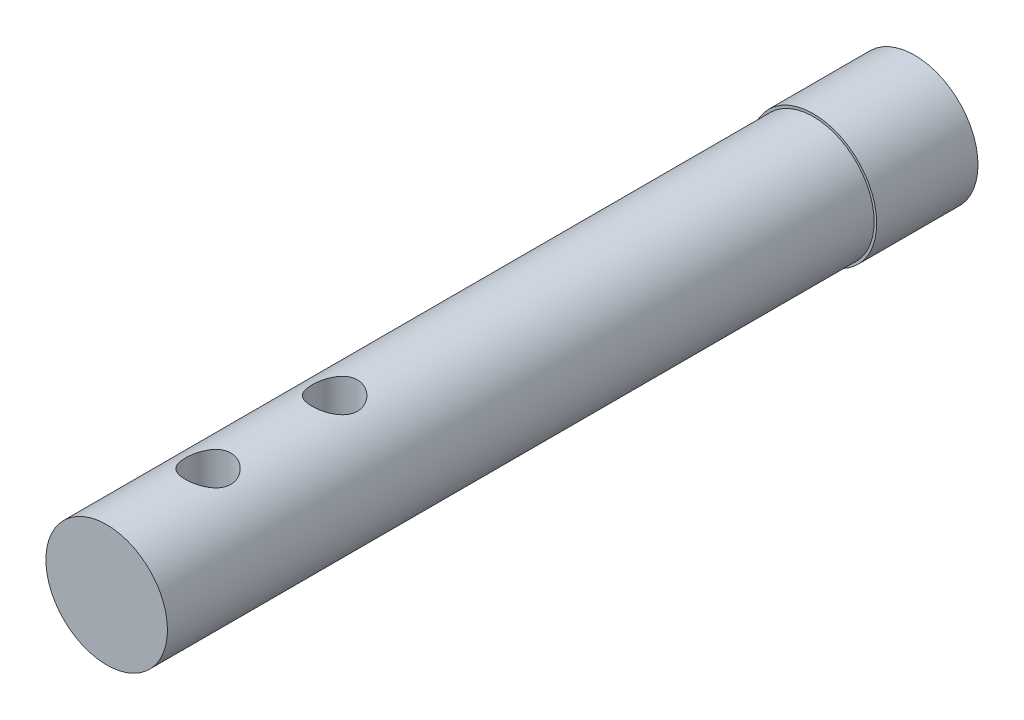
ISO-10303-21;
HEADER;
FILE_DESCRIPTION(('STEP AP214'),'2;1');
FILE_NAME('part.step','',(''),(''),'','','');
FILE_SCHEMA(('AUTOMOTIVE_DESIGN { 1 0 10303 214 1 1 1 1 }'));
ENDSEC;
DATA;
#1=APPLICATION_CONTEXT('core data for automotive mechanical design processes');
#2=APPLICATION_PROTOCOL_DEFINITION('international standard','automotive_design',2000,#1);
#3=PRODUCT_CONTEXT('',#1,'mechanical');
#4=PRODUCT('Part','Part','',(#3));
#5=PRODUCT_RELATED_PRODUCT_CATEGORY('part','',(#4));
#6=PRODUCT_DEFINITION_FORMATION('','',#4);
#7=PRODUCT_DEFINITION_CONTEXT('part definition',#1,'design');
#8=PRODUCT_DEFINITION('design','',#6,#7);
#9=PRODUCT_DEFINITION_SHAPE('','',#8);
#10=(LENGTH_UNIT() NAMED_UNIT(*) SI_UNIT(.MILLI.,.METRE.));
#11=(NAMED_UNIT(*) PLANE_ANGLE_UNIT() SI_UNIT($,.RADIAN.));
#12=(NAMED_UNIT(*) SI_UNIT($,.STERADIAN.) SOLID_ANGLE_UNIT());
#13=UNCERTAINTY_MEASURE_WITH_UNIT(LENGTH_MEASURE(1.E-05),#10,'distance_accuracy_value','');
#14=(GEOMETRIC_REPRESENTATION_CONTEXT(3) GLOBAL_UNCERTAINTY_ASSIGNED_CONTEXT((#13)) GLOBAL_UNIT_ASSIGNED_CONTEXT((#10,
#11,#12)) REPRESENTATION_CONTEXT('',''));
#15=CARTESIAN_POINT('',(0.,0.,0.));
#16=DIRECTION('',(0.,0.,1.));
#17=DIRECTION('',(1.,0.,0.));
#18=AXIS2_PLACEMENT_3D('',#15,#16,#17);
#19=CARTESIAN_POINT('',(0.,0.,35.));
#20=DIRECTION('',(0.,0.,-1.));
#21=DIRECTION('',(-1.,0.,0.));
#22=AXIS2_PLACEMENT_3D('',#19,#20,#21);
#23=CYLINDRICAL_SURFACE('',#22,12.5);
#24=CARTESIAN_POINT('',(0.,0.,35.));
#25=DIRECTION('',(0.,0.,1.));
#26=DIRECTION('',(1.,0.,0.));
#27=AXIS2_PLACEMENT_3D('',#24,#25,#26);
#28=CIRCLE('',#27,12.5);
#29=CARTESIAN_POINT('',(12.5,0.,35.));
#30=VERTEX_POINT('',#29);
#31=EDGE_CURVE('E52',#30,#30,#28,.T.);
#32=ORIENTED_EDGE('',*,*,#31,.F.);
#33=EDGE_LOOP('',(#32));
#34=FACE_BOUND('',#33,.T.);
#35=CARTESIAN_POINT('',(0.,0.,15.));
#36=DIRECTION('',(0.,0.,1.));
#37=DIRECTION('',(1.,0.,0.));
#38=AXIS2_PLACEMENT_3D('',#35,#36,#37);
#39=CIRCLE('',#38,12.5);
#40=CARTESIAN_POINT('',(12.5,0.,15.));
#41=VERTEX_POINT('',#40);
#42=EDGE_CURVE('E59',#41,#41,#39,.T.);
#43=ORIENTED_EDGE('',*,*,#42,.T.);
#44=EDGE_LOOP('',(#43));
#45=FACE_BOUND('',#44,.T.);
#46=ADVANCED_FACE('F39',(#34,#45),#23,.T.);
#47=CARTESIAN_POINT('',(0.,0.,35.));
#48=DIRECTION('',(0.,0.,1.));
#49=DIRECTION('',(1.,0.,0.));
#50=AXIS2_PLACEMENT_3D('',#47,#48,#49);
#51=PLANE('',#50);
#52=CARTESIAN_POINT('',(0.,0.,35.));
#53=DIRECTION('',(0.,0.,1.));
#54=DIRECTION('',(1.,0.,0.));
#55=AXIS2_PLACEMENT_3D('',#52,#53,#54);
#56=CIRCLE('',#55,12.);
#57=CARTESIAN_POINT('',(12.,0.,35.));
#58=VERTEX_POINT('',#57);
#59=EDGE_CURVE('E10',#58,#58,#56,.T.);
#60=ORIENTED_EDGE('',*,*,#59,.F.);
#61=EDGE_LOOP('',(#60));
#62=FACE_BOUND('',#61,.T.);
#63=ORIENTED_EDGE('',*,*,#31,.T.);
#64=EDGE_LOOP('',(#63));
#65=FACE_BOUND('',#64,.T.);
#66=ADVANCED_FACE('F100',(#62,#65),#51,.T.);
#67=CARTESIAN_POINT('',(0.,0.,15.));
#68=DIRECTION('',(0.,0.,1.));
#69=DIRECTION('',(1.,0.,0.));
#70=AXIS2_PLACEMENT_3D('',#67,#68,#69);
#71=PLANE('',#70);
#72=ORIENTED_EDGE('',*,*,#42,.F.);
#73=EDGE_LOOP('',(#72));
#74=FACE_BOUND('',#73,.T.);
#75=ADVANCED_FACE('F96',(#74),#71,.F.);
#76=CARTESIAN_POINT('',(0.,0.,174.5));
#77=DIRECTION('',(0.,0.,-1.));
#78=DIRECTION('',(-1.,0.,0.));
#79=AXIS2_PLACEMENT_3D('',#76,#77,#78);
#80=CYLINDRICAL_SURFACE('',#79,12.);
#81=CARTESIAN_POINT('',(0.,-12.,134.));
#82=CARTESIAN_POINT('',(0.121821920216142,-12.0000004149463,134.000000562589));
#83=CARTESIAN_POINT('',(0.243636002691338,-11.9981409348073,133.995049364538));
#84=CARTESIAN_POINT('',(0.486392423781219,-11.9907535477711,133.975293911888));
#85=CARTESIAN_POINT('',(0.607334471202255,-11.9852244680872,133.960486507286));
#86=CARTESIAN_POINT('',(0.847347381687187,-11.970649565472,133.921174413436));
#87=CARTESIAN_POINT('',(0.966419205128131,-11.9616056132673,133.896674882519));
#88=CARTESIAN_POINT('',(1.2019581040135,-11.9402382455256,133.83820576059));
#89=CARTESIAN_POINT('',(1.31842414848255,-11.9279135559973,133.804232490447));
#90=CARTESIAN_POINT('',(1.54765442429004,-11.9003384511568,133.727214849951));
#91=CARTESIAN_POINT('',(1.66042673449102,-11.8850950009216,133.684192050998));
#92=CARTESIAN_POINT('',(1.8818570560588,-11.8520536393113,133.589393964957));
#93=CARTESIAN_POINT('',(1.9905135235081,-11.8342547811235,133.537615432482));
#94=CARTESIAN_POINT('',(2.30927279411986,-11.7776768093622,133.369731594457));
#95=CARTESIAN_POINT('',(2.51234231941557,-11.7356939966762,133.241018203868));
#96=CARTESIAN_POINT('',(2.9020697747799,-11.6455850212357,132.948156633399));
#97=CARTESIAN_POINT('',(3.0878017206313,-11.5972851945296,132.782840477992));
#98=CARTESIAN_POINT('',(3.42974311725178,-11.500801507554,132.423737421702));
#99=CARTESIAN_POINT('',(3.58594353155375,-11.4526176872201,132.229941838426));
#100=CARTESIAN_POINT('',(3.79764477617945,-11.3834841407686,131.917559070828));
#101=CARTESIAN_POINT('',(3.86547493196539,-11.3605705131175,131.807562616254));
#102=CARTESIAN_POINT('',(3.9915740818886,-11.3168804194774,131.581831512047));
#103=CARTESIAN_POINT('',(4.04984690983619,-11.2961030977882,131.466099187672));
#104=CARTESIAN_POINT('',(4.15634309619246,-11.257354412399,131.229634242611));
#105=CARTESIAN_POINT('',(4.204565278964,-11.2393833770156,131.108901038945));
#106=CARTESIAN_POINT('',(4.29047551547086,-11.2068698048304,130.863350953977));
#107=CARTESIAN_POINT('',(4.32816865016454,-11.1923256148824,130.738536074949));
#108=CARTESIAN_POINT('',(4.3913383306389,-11.167687799886,130.490864282486));
#109=CARTESIAN_POINT('',(4.41724869222402,-11.1574374723367,130.368133574559));
#110=CARTESIAN_POINT('',(4.45874705417237,-11.1409189584307,130.120724885637));
#111=CARTESIAN_POINT('',(4.47433956871923,-11.1346490306496,129.996047780687));
#112=CARTESIAN_POINT('',(4.49504192825722,-11.1263077224061,129.745703904304));
#113=CARTESIAN_POINT('',(4.50015334189904,-11.124235713664,129.620037283793));
#114=CARTESIAN_POINT('',(4.4998396408155,-11.124362586323,129.368723898627));
#115=CARTESIAN_POINT('',(4.4944149347736,-11.1265613020677,129.24307713339));
#116=CARTESIAN_POINT('',(4.47373138181252,-11.1348931002806,129.000345583509));
#117=CARTESIAN_POINT('',(4.45908334347361,-11.1407817124043,128.883200175152));
#118=CARTESIAN_POINT('',(4.42068867776496,-11.1560711786316,128.650631735769));
#119=CARTESIAN_POINT('',(4.39693902815623,-11.1654731993557,128.535209290103));
#120=CARTESIAN_POINT('',(4.31234407385654,-11.1985472030748,128.192770983112));
#121=CARTESIAN_POINT('',(4.23813423625878,-11.2270952052095,127.969371280221));
#122=CARTESIAN_POINT('',(4.05490721343478,-11.294571324263,127.534132319446));
#123=CARTESIAN_POINT('',(3.94525805379045,-11.3336856090866,127.32259174478));
#124=CARTESIAN_POINT('',(3.69468362169029,-11.417826234714,126.920172587469));
#125=CARTESIAN_POINT('',(3.55374755073014,-11.4628546145386,126.729301172593));
#126=CARTESIAN_POINT('',(3.23345300799872,-11.5574411862383,126.360186122089));
#127=CARTESIAN_POINT('',(3.0521488502735,-11.607100429164,126.18365330368));
#128=CARTESIAN_POINT('',(2.66193788370919,-11.7027518394278,125.862986875577));
#129=CARTESIAN_POINT('',(2.45302684040979,-11.7487434424691,125.718858245353));
#130=CARTESIAN_POINT('',(2.00917028059688,-11.8327918458053,125.465208596408));
#131=CARTESIAN_POINT('',(1.7738721337926,-11.8707149483013,125.356257198474));
#132=CARTESIAN_POINT('',(1.28651055931181,-11.9333615492963,125.180052245027));
#133=CARTESIAN_POINT('',(1.03445463312942,-11.9580909097264,125.1127801694));
#134=CARTESIAN_POINT('',(0.535125728885326,-11.9905332973328,125.025131619306));
#135=CARTESIAN_POINT('',(0.288310863440795,-11.9990810722223,125.002452162351));
#136=CARTESIAN_POINT('',(-0.205717430518209,-12.0007768095524,124.997926826798));
#137=CARTESIAN_POINT('',(-0.452930758520929,-11.9939281862917,125.016071894972));
#138=CARTESIAN_POINT('',(-0.930786126866786,-11.9661512982893,125.090930073153));
#139=CARTESIAN_POINT('',(-1.16169991458788,-11.9457741475744,125.146134437354));
#140=CARTESIAN_POINT('',(-1.61082533431485,-11.8935442940439,125.291558411525));
#141=CARTESIAN_POINT('',(-1.82903531000967,-11.8616900987367,125.381782575638));
#142=CARTESIAN_POINT('',(-2.25374302875422,-11.7884888040033,125.597558494317));
#143=CARTESIAN_POINT('',(-2.45970824228691,-11.7468902777666,125.724070377444));
#144=CARTESIAN_POINT('',(-2.84817914393921,-11.6587998753534,126.00775712078));
#145=CARTESIAN_POINT('',(-3.03067612982124,-11.6123061955645,126.164943301224));
#146=CARTESIAN_POINT('',(-3.37808840855275,-11.516200958323,126.516201253386));
#147=CARTESIAN_POINT('',(-3.5413693394753,-11.4665650100461,126.711883953797));
#148=CARTESIAN_POINT('',(-3.83314678656081,-11.372360357102,127.128996752468));
#149=CARTESIAN_POINT('',(-3.96164017919756,-11.3277921076647,127.350429160209));
#150=CARTESIAN_POINT('',(-4.12541953452075,-11.2687303690453,127.697922796397));
#151=CARTESIAN_POINT('',(-4.17527938653558,-11.2503030894951,127.816647329586));
#152=CARTESIAN_POINT('',(-4.26475585416722,-11.2166905930926,128.058323845116));
#153=CARTESIAN_POINT('',(-4.30437682733461,-11.2015039975232,128.181274003754));
#154=CARTESIAN_POINT('',(-4.37296242168505,-11.1749073223601,128.430466472104));
#155=CARTESIAN_POINT('',(-4.40193024471254,-11.163496108165,128.556707780413));
#156=CARTESIAN_POINT('',(-4.44890662829911,-11.1448585297206,128.81151813959));
#157=CARTESIAN_POINT('',(-4.46691595320738,-11.1376318736025,128.940087027466));
#158=CARTESIAN_POINT('',(-4.4909611175474,-11.1279568107625,129.190138338187));
#159=CARTESIAN_POINT('',(-4.4976937576826,-11.1252304971503,129.311543515748));
#160=CARTESIAN_POINT('',(-4.50131029580419,-11.1237678185175,129.554568299403));
#161=CARTESIAN_POINT('',(-4.49819087218451,-11.1250327991546,129.676187963996));
#162=CARTESIAN_POINT('',(-4.48213280066959,-11.131512007523,129.918611778483));
#163=CARTESIAN_POINT('',(-4.46919877710472,-11.1367243753675,130.039416285416));
#164=CARTESIAN_POINT('',(-4.4336489114592,-11.150924738849,130.279410101132));
#165=CARTESIAN_POINT('',(-4.41102942370238,-11.1599141561698,130.398598784262));
#166=CARTESIAN_POINT('',(-4.35718066722755,-11.1810458214159,130.630811506595));
#167=CARTESIAN_POINT('',(-4.32623979458421,-11.1930817833517,130.743912139277));
#168=CARTESIAN_POINT('',(-4.25575591081443,-11.220069483486,130.967056271898));
#169=CARTESIAN_POINT('',(-4.21620988547499,-11.23502224319,131.077098685333));
#170=CARTESIAN_POINT('',(-4.08512625929658,-11.2836374066331,131.401595505612));
#171=CARTESIAN_POINT('',(-3.98110253179988,-11.3210734609741,131.610592817196));
#172=CARTESIAN_POINT('',(-3.73655960136618,-11.4041928736043,132.019509886323));
#173=CARTESIAN_POINT('',(-3.5944131560853,-11.4502056852775,132.218379513829));
#174=CARTESIAN_POINT('',(-3.28000639093493,-11.5441926723436,132.590437563583));
#175=CARTESIAN_POINT('',(-3.10773650011229,-11.5921674673836,132.763617791262));
#176=CARTESIAN_POINT('',(-2.82485495768737,-11.6632064644304,133.005245875948));
#177=CARTESIAN_POINT('',(-2.72355677041139,-11.6873329442322,133.084523984934));
#178=CARTESIAN_POINT('',(-2.5143325103599,-11.7341212355869,133.234254321495));
#179=CARTESIAN_POINT('',(-2.40640888366378,-11.7567835814237,133.304709777492));
#180=CARTESIAN_POINT('',(-2.18454509687349,-11.8000231112314,133.436294134108));
#181=CARTESIAN_POINT('',(-2.07060177268692,-11.8205991816831,133.497418062869));
#182=CARTESIAN_POINT('',(-1.83755175113718,-11.8590616275344,133.609759993606));
#183=CARTESIAN_POINT('',(-1.71844727331546,-11.8769491446375,133.66098220304));
#184=CARTESIAN_POINT('',(-1.47053797162902,-11.9102407175975,133.755097964792));
#185=CARTESIAN_POINT('',(-1.34153686175292,-11.9255011706843,133.797526838323));
#186=CARTESIAN_POINT('',(-1.07989915577465,-11.9520331999052,133.870612963128));
#187=CARTESIAN_POINT('',(-0.94726417967497,-11.9633065233273,133.901275371348));
#188=CARTESIAN_POINT('',(-0.679492491904594,-11.9814979813589,133.950485060083));
#189=CARTESIAN_POINT('',(-0.544356226207085,-11.9884168847946,133.969034479318));
#190=CARTESIAN_POINT('',(-0.27280993479056,-11.9976674031164,133.993790938277));
#191=CARTESIAN_POINT('',(-0.136400054481806,-11.9999995353981,133.999999370088));
#192=CARTESIAN_POINT('',(0.,-12.,134.));
#193=B_SPLINE_CURVE_WITH_KNOTS('',3,(#81,#82,#83,#84,#85,#86,#87,#88,#89,#90,#91,#92,#93,#94,
#95,#96,#97,#98,#99,#100,#101,#102,#103,#104,#105,#106,#107,#108,#109,#110,#111,#112,#113,#114,
#115,#116,#117,#118,#119,#120,#121,#122,#123,#124,#125,#126,#127,#128,#129,#130,#131,#132,#133,
#134,#135,#136,#137,#138,#139,#140,#141,#142,#143,#144,#145,#146,#147,#148,#149,#150,#151,#152,
#153,#154,#155,#156,#157,#158,#159,#160,#161,#162,#163,#164,#165,#166,#167,#168,#169,#170,#171,
#172,#173,#174,#175,#176,#177,#178,#179,#180,#181,#182,#183,#184,#185,#186,#187,#188,#189,#190,
#191,#192),.UNSPECIFIED.,.T.,.F.,(4,2,2,2,2,2,2,2,2,2,2,2,2,2,2,2,2,2,2,2,2,2,2,2,2,2,2,2,2,2,2,
2,2,2,2,2,2,2,2,2,2,2,2,2,2,2,2,2,2,2,2,2,2,2,2,4),(0.,0.365338024506955,0.730792865566527,
1.09605346575197,1.46145611308566,1.82599742407276,2.19067415273864,2.9194701839264,
3.67616860257941,4.43309819286663,4.82642681378572,5.21959726757269,5.61281368524474,
6.00584002102335,6.38291145568146,6.75981780772983,7.13666774608816,7.51350306718057,
7.86768402280129,8.2219826881596,8.92994647641834,9.65130458621124,10.3729120569285,
11.1430169346751,11.9132400717527,12.695373593183,13.477159325566,14.2173829236784,
14.9574423863163,15.6690654723159,16.3807811322343,17.1134089903886,17.8463077351967,
18.6217279182704,19.3972177022049,19.7870381951625,20.1766925107005,20.566229618268,
20.9557395527225,21.3201489316713,21.6846811837186,22.0490417862153,22.4135396573091,
22.7667469946614,23.1200782532196,23.8262105801188,24.5693581369517,25.3127422403355,
25.7049754844993,26.0970647789657,26.4893622558027,26.8814926686161,27.2908478409866,
27.7000233978563,28.1091266894863,28.5181838309154),.UNSPECIFIED.);
#194=CARTESIAN_POINT('',(0.,-12.,134.));
#195=VERTEX_POINT('',#194);
#196=EDGE_CURVE('E42',#195,#195,#193,.T.);
#197=ORIENTED_EDGE('',*,*,#196,.T.);
#198=EDGE_LOOP('',(#197));
#199=FACE_BOUND('',#198,.T.);
#200=CARTESIAN_POINT('',(0.,12.,134.));
#201=CARTESIAN_POINT('',(-0.121821920216149,12.0000004149463,134.000000562589));
#202=CARTESIAN_POINT('',(-0.243636002691345,11.9981409348073,133.995049364538));
#203=CARTESIAN_POINT('',(-0.486392423781227,11.9907535477711,133.975293911888));
#204=CARTESIAN_POINT('',(-0.607334471202263,11.9852244680872,133.960486507286));
#205=CARTESIAN_POINT('',(-0.847347381687197,11.970649565472,133.921174413436));
#206=CARTESIAN_POINT('',(-0.966419205128144,11.9616056132673,133.896674882519));
#207=CARTESIAN_POINT('',(-1.20195810401351,11.9402382455256,133.83820576059));
#208=CARTESIAN_POINT('',(-1.31842414848256,11.9279135559973,133.804232490447));
#209=CARTESIAN_POINT('',(-1.54765442429004,11.9003384511568,133.727214849951));
#210=CARTESIAN_POINT('',(-1.66042673449101,11.8850950009216,133.684192050998));
#211=CARTESIAN_POINT('',(-1.88185705605879,11.8520536393113,133.589393964957));
#212=CARTESIAN_POINT('',(-1.99051352350808,11.8342547811235,133.537615432482));
#213=CARTESIAN_POINT('',(-2.30927279411986,11.7776768093622,133.369731594457));
#214=CARTESIAN_POINT('',(-2.51234231941559,11.7356939966761,133.241018203868));
#215=CARTESIAN_POINT('',(-2.9020697747799,11.6455850212357,132.9481566334));
#216=CARTESIAN_POINT('',(-3.08780172063124,11.5972851945296,132.782840477992));
#217=CARTESIAN_POINT('',(-3.42974311725175,11.500801507554,132.423737421702));
#218=CARTESIAN_POINT('',(-3.58594353155377,11.4526176872201,132.229941838426));
#219=CARTESIAN_POINT('',(-3.79764477617945,11.3834841407686,131.917559070828));
#220=CARTESIAN_POINT('',(-3.86547493196535,11.3605705131175,131.807562616254));
#221=CARTESIAN_POINT('',(-3.99157408188855,11.3168804194774,131.581831512047));
#222=CARTESIAN_POINT('',(-4.04984690983616,11.2961030977882,131.466099187672));
#223=CARTESIAN_POINT('',(-4.15634309619244,11.257354412399,131.229634242611));
#224=CARTESIAN_POINT('',(-4.20456527896397,11.2393833770156,131.108901038945));
#225=CARTESIAN_POINT('',(-4.29047551547084,11.2068698048304,130.863350953977));
#226=CARTESIAN_POINT('',(-4.32816865016454,11.1923256148824,130.738536074949));
#227=CARTESIAN_POINT('',(-4.3913383306389,11.167687799886,130.490864282486));
#228=CARTESIAN_POINT('',(-4.41724869222401,11.1574374723367,130.368133574559));
#229=CARTESIAN_POINT('',(-4.45874705417236,11.1409189584307,130.120724885637));
#230=CARTESIAN_POINT('',(-4.47433956871923,11.1346490306496,129.996047780687));
#231=CARTESIAN_POINT('',(-4.49504192825722,11.1263077224061,129.745703904304));
#232=CARTESIAN_POINT('',(-4.50015334189905,11.124235713664,129.620037283793));
#233=CARTESIAN_POINT('',(-4.4998396408155,11.124362586323,129.368723898627));
#234=CARTESIAN_POINT('',(-4.49441493477359,11.1265613020677,129.24307713339));
#235=CARTESIAN_POINT('',(-4.47373138181252,11.1348931002806,129.000345583509));
#236=CARTESIAN_POINT('',(-4.45908334347362,11.1407817124043,128.883200175152));
#237=CARTESIAN_POINT('',(-4.42068867776498,11.1560711786316,128.650631735769));
#238=CARTESIAN_POINT('',(-4.39693902815624,11.1654731993557,128.535209290103));
#239=CARTESIAN_POINT('',(-4.31234407385655,11.1985472030748,128.192770983112));
#240=CARTESIAN_POINT('',(-4.23813423625877,11.2270952052095,127.969371280221));
#241=CARTESIAN_POINT('',(-4.05490721343479,11.294571324263,127.534132319446));
#242=CARTESIAN_POINT('',(-3.94525805379048,11.3336856090865,127.32259174478));
#243=CARTESIAN_POINT('',(-3.69468362169032,11.417826234714,126.920172587469));
#244=CARTESIAN_POINT('',(-3.55374755073014,11.4628546145386,126.729301172593));
#245=CARTESIAN_POINT('',(-3.23345300799872,11.5574411862383,126.360186122089));
#246=CARTESIAN_POINT('',(-3.05214885027356,11.607100429164,126.18365330368));
#247=CARTESIAN_POINT('',(-2.66193788370925,11.7027518394278,125.862986875577));
#248=CARTESIAN_POINT('',(-2.45302684040981,11.7487434424691,125.718858245353));
#249=CARTESIAN_POINT('',(-2.00917028059688,11.8327918458053,125.465208596408));
#250=CARTESIAN_POINT('',(-1.77387213379263,11.8707149483013,125.356257198474));
#251=CARTESIAN_POINT('',(-1.28651055931185,11.9333615492963,125.180052245027));
#252=CARTESIAN_POINT('',(-1.03445463312944,11.9580909097264,125.1127801694));
#253=CARTESIAN_POINT('',(-0.535125728885335,11.9905332973328,125.025131619306));
#254=CARTESIAN_POINT('',(-0.288310863440809,11.9990810722223,125.002452162351));
#255=CARTESIAN_POINT('',(0.205717430518195,12.0007768095524,124.997926826798));
#256=CARTESIAN_POINT('',(0.452930758520921,11.9939281862917,125.016071894972));
#257=CARTESIAN_POINT('',(0.930786126866769,11.9661512982893,125.090930073153));
#258=CARTESIAN_POINT('',(1.16169991458785,11.9457741475744,125.146134437354));
#259=CARTESIAN_POINT('',(1.61082533431483,11.8935442940439,125.291558411525));
#260=CARTESIAN_POINT('',(1.82903531000968,11.8616900987367,125.381782575637));
#261=CARTESIAN_POINT('',(2.25374302875422,11.7884888040033,125.597558494317));
#262=CARTESIAN_POINT('',(2.45970824228687,11.7468902777666,125.724070377444));
#263=CARTESIAN_POINT('',(2.84817914393918,11.6587998753534,126.00775712078));
#264=CARTESIAN_POINT('',(3.03067612982123,11.6123061955645,126.164943301224));
#265=CARTESIAN_POINT('',(3.37808840855275,11.516200958323,126.516201253386));
#266=CARTESIAN_POINT('',(3.54136933947526,11.4665650100462,126.711883953797));
#267=CARTESIAN_POINT('',(3.83314678656077,11.372360357102,127.128996752468));
#268=CARTESIAN_POINT('',(3.96164017919754,11.3277921076647,127.350429160209));
#269=CARTESIAN_POINT('',(4.12541953452075,11.2687303690453,127.697922796397));
#270=CARTESIAN_POINT('',(4.17527938653557,11.2503030894951,127.816647329586));
#271=CARTESIAN_POINT('',(4.26475585416721,11.2166905930926,128.058323845116));
#272=CARTESIAN_POINT('',(4.3043768273346,11.2015039975232,128.181274003754));
#273=CARTESIAN_POINT('',(4.37296242168504,11.1749073223601,128.430466472104));
#274=CARTESIAN_POINT('',(4.40193024471253,11.163496108165,128.556707780413));
#275=CARTESIAN_POINT('',(4.44890662829911,11.1448585297206,128.81151813959));
#276=CARTESIAN_POINT('',(4.46691595320738,11.1376318736025,128.940087027466));
#277=CARTESIAN_POINT('',(4.49096111754739,11.1279568107625,129.190138338187));
#278=CARTESIAN_POINT('',(4.49769375768259,11.1252304971503,129.311543515748));
#279=CARTESIAN_POINT('',(4.50131029580418,11.1237678185175,129.554568299403));
#280=CARTESIAN_POINT('',(4.49819087218451,11.1250327991546,129.676187963996));
#281=CARTESIAN_POINT('',(4.48213280066958,11.131512007523,129.918611778483));
#282=CARTESIAN_POINT('',(4.46919877710471,11.1367243753675,130.039416285416));
#283=CARTESIAN_POINT('',(4.4336489114592,11.150924738849,130.279410101132));
#284=CARTESIAN_POINT('',(4.41102942370239,11.1599141561698,130.398598784262));
#285=CARTESIAN_POINT('',(4.35718066722756,11.1810458214159,130.630811506595));
#286=CARTESIAN_POINT('',(4.32623979458421,11.1930817833517,130.743912139277));
#287=CARTESIAN_POINT('',(4.25575591081444,11.220069483486,130.967056271898));
#288=CARTESIAN_POINT('',(4.21620988547501,11.23502224319,131.077098685333));
#289=CARTESIAN_POINT('',(4.08512625929659,11.2836374066331,131.401595505612));
#290=CARTESIAN_POINT('',(3.98110253179986,11.3210734609741,131.610592817196));
#291=CARTESIAN_POINT('',(3.73655960136618,11.4041928736043,132.019509886323));
#292=CARTESIAN_POINT('',(3.59441315608535,11.4502056852775,132.218379513829));
#293=CARTESIAN_POINT('',(3.28000639093496,11.5441926723435,132.590437563583));
#294=CARTESIAN_POINT('',(3.10773650011226,11.5921674673837,132.763617791262));
#295=CARTESIAN_POINT('',(2.82485495768737,11.6632064644304,133.005245875948));
#296=CARTESIAN_POINT('',(2.72355677041142,11.6873329442322,133.084523984934));
#297=CARTESIAN_POINT('',(2.51433251035994,11.7341212355869,133.234254321495));
#298=CARTESIAN_POINT('',(2.4064088836638,11.7567835814237,133.304709777492));
#299=CARTESIAN_POINT('',(2.1845450968735,11.8000231112314,133.436294134108));
#300=CARTESIAN_POINT('',(2.07060177268693,11.8205991816831,133.497418062869));
#301=CARTESIAN_POINT('',(1.83755175113719,11.8590616275344,133.609759993606));
#302=CARTESIAN_POINT('',(1.71844727331546,11.8769491446376,133.66098220304));
#303=CARTESIAN_POINT('',(1.47053797162901,11.9102407175975,133.755097964792));
#304=CARTESIAN_POINT('',(1.34153686175291,11.9255011706843,133.797526838323));
#305=CARTESIAN_POINT('',(1.07989915577464,11.9520331999052,133.870612963128));
#306=CARTESIAN_POINT('',(0.94726417967496,11.9633065233273,133.901275371348));
#307=CARTESIAN_POINT('',(0.679492491904587,11.9814979813589,133.950485060083));
#308=CARTESIAN_POINT('',(0.544356226207079,11.9884168847946,133.969034479318));
#309=CARTESIAN_POINT('',(0.272809934790555,11.9976674031164,133.993790938277));
#310=CARTESIAN_POINT('',(0.1364000544818,11.9999995353981,133.999999370088));
#311=CARTESIAN_POINT('',(0.,12.,134.));
#312=B_SPLINE_CURVE_WITH_KNOTS('',3,(#200,#201,#202,#203,#204,#205,#206,#207,#208,#209,#210,
#211,#212,#213,#214,#215,#216,#217,#218,#219,#220,#221,#222,#223,#224,#225,#226,#227,#228,#229,
#230,#231,#232,#233,#234,#235,#236,#237,#238,#239,#240,#241,#242,#243,#244,#245,#246,#247,#248,
#249,#250,#251,#252,#253,#254,#255,#256,#257,#258,#259,#260,#261,#262,#263,#264,#265,#266,#267,
#268,#269,#270,#271,#272,#273,#274,#275,#276,#277,#278,#279,#280,#281,#282,#283,#284,#285,#286,
#287,#288,#289,#290,#291,#292,#293,#294,#295,#296,#297,#298,#299,#300,#301,#302,#303,#304,#305,
#306,#307,#308,#309,#310,#311),.UNSPECIFIED.,.T.,.F.,(4,2,2,2,2,2,2,2,2,2,2,2,2,2,2,2,2,2,2,2,2,
2,2,2,2,2,2,2,2,2,2,2,2,2,2,2,2,2,2,2,2,2,2,2,2,2,2,2,2,2,2,2,2,2,2,4),(0.,0.365338024506955,
0.730792865566528,1.09605346575198,1.46145611308566,1.82599742407274,2.19067415273861,
2.91947018392634,3.67616860257935,4.43309819286656,4.82642681378565,5.21959726757259,
5.61281368524468,6.00584002102326,6.38291145568137,6.75981780772974,7.13666774608808,
7.51350306718049,7.86768402280126,8.2219826881596,8.92994647641836,9.65130458621123,
10.3729120569284,11.1430169346751,11.9132400717527,12.6953735931829,13.477159325566,
14.2173829236784,14.9574423863163,15.6690654723159,16.3807811322342,17.1134089903886,
17.8463077351967,18.6217279182704,19.3972177022049,19.7870381951626,20.1766925107005,
20.5662296182681,20.9557395527225,21.3201489316714,21.6846811837187,22.0490417862154,
22.4135396573091,22.7667469946614,23.1200782532195,23.8262105801187,24.5693581369517,
25.3127422403354,25.7049754844993,26.0970647789656,26.4893622558027,26.8814926686161,
27.2908478409866,27.7000233978563,28.1091266894863,28.5181838309154),.UNSPECIFIED.);
#313=CARTESIAN_POINT('',(0.,12.,134.));
#314=VERTEX_POINT('',#313);
#315=EDGE_CURVE('E157',#314,#314,#312,.T.);
#316=ORIENTED_EDGE('',*,*,#315,.T.);
#317=EDGE_LOOP('',(#316));
#318=FACE_BOUND('',#317,.T.);
#319=CARTESIAN_POINT('',(0.,-12.,159.));
#320=CARTESIAN_POINT('',(0.121821920216144,-12.0000004149463,159.000000562589));
#321=CARTESIAN_POINT('',(0.243636002691342,-11.9981409348073,158.995049364538));
#322=CARTESIAN_POINT('',(0.486392423781224,-11.9907535477711,158.975293911888));
#323=CARTESIAN_POINT('',(0.607334471202259,-11.9852244680872,158.960486507286));
#324=CARTESIAN_POINT('',(0.847347381687201,-11.970649565472,158.921174413436));
#325=CARTESIAN_POINT('',(0.966419205128156,-11.9616056132673,158.896674882519));
#326=CARTESIAN_POINT('',(1.20195810401351,-11.9402382455256,158.83820576059));
#327=CARTESIAN_POINT('',(1.31842414848255,-11.9279135559973,158.804232490447));
#328=CARTESIAN_POINT('',(1.54765442429004,-11.9003384511568,158.727214849951));
#329=CARTESIAN_POINT('',(1.66042673449104,-11.8850950009216,158.684192050998));
#330=CARTESIAN_POINT('',(1.88185705605885,-11.8520536393113,158.589393964957));
#331=CARTESIAN_POINT('',(1.99051352350814,-11.8342547811235,158.537615432482));
#332=CARTESIAN_POINT('',(2.30927279411988,-11.7776768093622,158.369731594457));
#333=CARTESIAN_POINT('',(2.51234231941558,-11.7356939966761,158.241018203868));
#334=CARTESIAN_POINT('',(2.9020697747799,-11.6455850212357,157.948156633399));
#335=CARTESIAN_POINT('',(3.0878017206313,-11.5972851945296,157.782840477992));
#336=CARTESIAN_POINT('',(3.42974311725179,-11.500801507554,157.423737421702));
#337=CARTESIAN_POINT('',(3.58594353155375,-11.4526176872201,157.229941838426));
#338=CARTESIAN_POINT('',(3.79764477617945,-11.3834841407686,156.917559070828));
#339=CARTESIAN_POINT('',(3.86547493196539,-11.3605705131175,156.807562616254));
#340=CARTESIAN_POINT('',(3.9915740818886,-11.3168804194774,156.581831512047));
#341=CARTESIAN_POINT('',(4.04984690983619,-11.2961030977882,156.466099187672));
#342=CARTESIAN_POINT('',(4.15634309619246,-11.257354412399,156.229634242611));
#343=CARTESIAN_POINT('',(4.204565278964,-11.2393833770156,156.108901038945));
#344=CARTESIAN_POINT('',(4.29047551547086,-11.2068698048304,155.863350953977));
#345=CARTESIAN_POINT('',(4.32816865016454,-11.1923256148824,155.738536074949));
#346=CARTESIAN_POINT('',(4.3913383306389,-11.167687799886,155.490864282486));
#347=CARTESIAN_POINT('',(4.41724869222402,-11.1574374723367,155.368133574559));
#348=CARTESIAN_POINT('',(4.45874705417237,-11.1409189584307,155.120724885637));
#349=CARTESIAN_POINT('',(4.47433956871923,-11.1346490306496,154.996047780687));
#350=CARTESIAN_POINT('',(4.49504192825722,-11.1263077224061,154.745703904304));
#351=CARTESIAN_POINT('',(4.50015334189904,-11.124235713664,154.620037283793));
#352=CARTESIAN_POINT('',(4.4998396408155,-11.124362586323,154.368723898627));
#353=CARTESIAN_POINT('',(4.4944149347736,-11.1265613020677,154.24307713339));
#354=CARTESIAN_POINT('',(4.47373138181252,-11.1348931002806,154.000345583509));
#355=CARTESIAN_POINT('',(4.45908334347361,-11.1407817124043,153.883200175152));
#356=CARTESIAN_POINT('',(4.42068867776496,-11.1560711786316,153.650631735769));
#357=CARTESIAN_POINT('',(4.39693902815623,-11.1654731993557,153.535209290103));
#358=CARTESIAN_POINT('',(4.31234407385654,-11.1985472030748,153.192770983112));
#359=CARTESIAN_POINT('',(4.23813423625878,-11.2270952052095,152.969371280221));
#360=CARTESIAN_POINT('',(4.05490721343478,-11.294571324263,152.534132319446));
#361=CARTESIAN_POINT('',(3.94525805379045,-11.3336856090866,152.322591744781));
#362=CARTESIAN_POINT('',(3.69468362169029,-11.417826234714,151.920172587469));
#363=CARTESIAN_POINT('',(3.55374755073014,-11.4628546145386,151.729301172593));
#364=CARTESIAN_POINT('',(3.23345300799872,-11.5574411862383,151.360186122089));
#365=CARTESIAN_POINT('',(3.0521488502735,-11.607100429164,151.18365330368));
#366=CARTESIAN_POINT('',(2.66193788370919,-11.7027518394278,150.862986875577));
#367=CARTESIAN_POINT('',(2.4530268404098,-11.7487434424691,150.718858245353));
#368=CARTESIAN_POINT('',(2.00917028059688,-11.8327918458053,150.465208596408));
#369=CARTESIAN_POINT('',(1.77387213379259,-11.8707149483013,150.356257198474));
#370=CARTESIAN_POINT('',(1.28651055931181,-11.9333615492963,150.180052245027));
#371=CARTESIAN_POINT('',(1.03445463312943,-11.9580909097264,150.1127801694));
#372=CARTESIAN_POINT('',(0.535125728885339,-11.9905332973328,150.025131619306));
#373=CARTESIAN_POINT('',(0.288310863440802,-11.9990810722223,150.002452162351));
#374=CARTESIAN_POINT('',(-0.205717430518212,-12.0007768095524,149.997926826798));
#375=CARTESIAN_POINT('',(-0.452930758520935,-11.9939281862917,150.016071894972));
#376=CARTESIAN_POINT('',(-0.930786126866784,-11.9661512982893,150.090930073153));
#377=CARTESIAN_POINT('',(-1.16169991458787,-11.9457741475744,150.146134437354));
#378=CARTESIAN_POINT('',(-1.61082533431484,-11.8935442940439,150.291558411525));
#379=CARTESIAN_POINT('',(-1.82903531000967,-11.8616900987367,150.381782575638));
#380=CARTESIAN_POINT('',(-2.25374302875424,-11.7884888040033,150.597558494317));
#381=CARTESIAN_POINT('',(-2.45970824228693,-11.7468902777666,150.724070377444));
#382=CARTESIAN_POINT('',(-2.84817914393923,-11.6587998753534,151.00775712078));
#383=CARTESIAN_POINT('',(-3.03067612982125,-11.6123061955645,151.164943301224));
#384=CARTESIAN_POINT('',(-3.37808840855274,-11.516200958323,151.516201253386));
#385=CARTESIAN_POINT('',(-3.54136933947529,-11.4665650100462,151.711883953797));
#386=CARTESIAN_POINT('',(-3.83314678656081,-11.372360357102,152.128996752468));
#387=CARTESIAN_POINT('',(-3.96164017919756,-11.3277921076647,152.350429160209));
#388=CARTESIAN_POINT('',(-4.12541953452075,-11.2687303690453,152.697922796397));
#389=CARTESIAN_POINT('',(-4.17527938653558,-11.2503030894951,152.816647329586));
#390=CARTESIAN_POINT('',(-4.26475585416722,-11.2166905930926,153.058323845116));
#391=CARTESIAN_POINT('',(-4.30437682733461,-11.2015039975232,153.181274003754));
#392=CARTESIAN_POINT('',(-4.37296242168505,-11.1749073223601,153.430466472104));
#393=CARTESIAN_POINT('',(-4.40193024471254,-11.163496108165,153.556707780413));
#394=CARTESIAN_POINT('',(-4.44890662829911,-11.1448585297206,153.81151813959));
#395=CARTESIAN_POINT('',(-4.46691595320738,-11.1376318736025,153.940087027466));
#396=CARTESIAN_POINT('',(-4.4909611175474,-11.1279568107625,154.190138338187));
#397=CARTESIAN_POINT('',(-4.4976937576826,-11.1252304971503,154.311543515748));
#398=CARTESIAN_POINT('',(-4.50131029580419,-11.1237678185175,154.554568299403));
#399=CARTESIAN_POINT('',(-4.49819087218451,-11.1250327991546,154.676187963996));
#400=CARTESIAN_POINT('',(-4.48213280066959,-11.131512007523,154.918611778483));
#401=CARTESIAN_POINT('',(-4.46919877710472,-11.1367243753675,155.039416285416));
#402=CARTESIAN_POINT('',(-4.4336489114592,-11.150924738849,155.279410101132));
#403=CARTESIAN_POINT('',(-4.41102942370239,-11.1599141561698,155.398598784262));
#404=CARTESIAN_POINT('',(-4.35718066722756,-11.1810458214159,155.630811506595));
#405=CARTESIAN_POINT('',(-4.32623979458421,-11.1930817833517,155.743912139277));
#406=CARTESIAN_POINT('',(-4.25575591081443,-11.220069483486,155.967056271898));
#407=CARTESIAN_POINT('',(-4.21620988547499,-11.23502224319,156.077098685333));
#408=CARTESIAN_POINT('',(-4.08512625929658,-11.2836374066331,156.401595505612));
#409=CARTESIAN_POINT('',(-3.98110253179988,-11.3210734609741,156.610592817196));
#410=CARTESIAN_POINT('',(-3.73655960136618,-11.4041928736043,157.019509886323));
#411=CARTESIAN_POINT('',(-3.5944131560853,-11.4502056852775,157.218379513829));
#412=CARTESIAN_POINT('',(-3.28000639093493,-11.5441926723436,157.590437563583));
#413=CARTESIAN_POINT('',(-3.10773650011229,-11.5921674673836,157.763617791262));
#414=CARTESIAN_POINT('',(-2.82485495768737,-11.6632064644304,158.005245875948));
#415=CARTESIAN_POINT('',(-2.72355677041139,-11.6873329442322,158.084523984934));
#416=CARTESIAN_POINT('',(-2.5143325103599,-11.7341212355869,158.234254321495));
#417=CARTESIAN_POINT('',(-2.40640888366378,-11.7567835814237,158.304709777492));
#418=CARTESIAN_POINT('',(-2.18454509687349,-11.8000231112314,158.436294134108));
#419=CARTESIAN_POINT('',(-2.07060177268692,-11.8205991816831,158.497418062869));
#420=CARTESIAN_POINT('',(-1.83755175113718,-11.8590616275344,158.609759993606));
#421=CARTESIAN_POINT('',(-1.71844727331546,-11.8769491446375,158.66098220304));
#422=CARTESIAN_POINT('',(-1.47053797162901,-11.9102407175975,158.755097964792));
#423=CARTESIAN_POINT('',(-1.34153686175291,-11.9255011706843,158.797526838323));
#424=CARTESIAN_POINT('',(-1.07989915577464,-11.9520331999052,158.870612963128));
#425=CARTESIAN_POINT('',(-0.947264179674962,-11.9633065233273,158.901275371348));
#426=CARTESIAN_POINT('',(-0.679492491904589,-11.9814979813589,158.950485060083));
#427=CARTESIAN_POINT('',(-0.544356226207082,-11.9884168847946,158.969034479318));
#428=CARTESIAN_POINT('',(-0.27280993479056,-11.9976674031164,158.993790938277));
#429=CARTESIAN_POINT('',(-0.136400054481806,-11.9999995353981,158.999999370088));
#430=CARTESIAN_POINT('',(0.,-12.,159.));
#431=B_SPLINE_CURVE_WITH_KNOTS('',3,(#319,#320,#321,#322,#323,#324,#325,#326,#327,#328,#329,
#330,#331,#332,#333,#334,#335,#336,#337,#338,#339,#340,#341,#342,#343,#344,#345,#346,#347,#348,
#349,#350,#351,#352,#353,#354,#355,#356,#357,#358,#359,#360,#361,#362,#363,#364,#365,#366,#367,
#368,#369,#370,#371,#372,#373,#374,#375,#376,#377,#378,#379,#380,#381,#382,#383,#384,#385,#386,
#387,#388,#389,#390,#391,#392,#393,#394,#395,#396,#397,#398,#399,#400,#401,#402,#403,#404,#405,
#406,#407,#408,#409,#410,#411,#412,#413,#414,#415,#416,#417,#418,#419,#420,#421,#422,#423,#424,
#425,#426,#427,#428,#429,#430),.UNSPECIFIED.,.T.,.F.,(4,2,2,2,2,2,2,2,2,2,2,2,2,2,2,2,2,2,2,2,2,
2,2,2,2,2,2,2,2,2,2,2,2,2,2,2,2,2,2,2,2,2,2,2,2,2,2,2,2,2,2,2,2,2,2,4),(0.,0.36533802450696,
0.730792865566531,1.096053465752,1.46145611308569,1.82599742407279,2.19067415273868,
2.91947018392639,3.6761686025794,4.43309819286661,4.82642681378571,5.21959726757267,
5.61281368524473,6.00584002102334,6.38291145568145,6.75981780772981,7.13666774608815,
7.51350306718056,7.86768402280127,8.22198268815959,8.92994647641832,9.65130458621123,
10.3729120569285,11.1430169346751,11.9132400717527,12.6953735931829,13.4771593255661,
14.2173829236784,14.9574423863163,15.6690654723159,16.3807811322343,17.1134089903887,
17.8463077351967,18.6217279182704,19.3972177022049,19.7870381951626,20.1766925107005,
20.5662296182681,20.9557395527225,21.3201489316714,21.6846811837186,22.0490417862154,
22.4135396573091,22.7667469946614,23.1200782532196,23.8262105801188,24.5693581369518,
25.3127422403355,25.7049754844993,26.0970647789657,26.4893622558027,26.8814926686162,
27.2908478409866,27.7000233978563,28.1091266894863,28.5181838309155),.UNSPECIFIED.);
#432=CARTESIAN_POINT('',(0.,-12.,159.));
#433=VERTEX_POINT('',#432);
#434=EDGE_CURVE('E75',#433,#433,#431,.T.);
#435=ORIENTED_EDGE('',*,*,#434,.T.);
#436=EDGE_LOOP('',(#435));
#437=FACE_BOUND('',#436,.T.);
#438=CARTESIAN_POINT('',(0.,12.,159.));
#439=CARTESIAN_POINT('',(-0.12182192021615,12.0000004149463,159.000000562589));
#440=CARTESIAN_POINT('',(-0.243636002691346,11.9981409348073,158.995049364538));
#441=CARTESIAN_POINT('',(-0.486392423781227,11.9907535477711,158.975293911888));
#442=CARTESIAN_POINT('',(-0.607334471202264,11.9852244680872,158.960486507286));
#443=CARTESIAN_POINT('',(-0.847347381687196,11.970649565472,158.921174413436));
#444=CARTESIAN_POINT('',(-0.966419205128139,11.9616056132673,158.896674882519));
#445=CARTESIAN_POINT('',(-1.2019581040135,11.9402382455256,158.83820576059));
#446=CARTESIAN_POINT('',(-1.31842414848256,11.9279135559973,158.804232490447));
#447=CARTESIAN_POINT('',(-1.54765442429005,11.9003384511568,158.727214849951));
#448=CARTESIAN_POINT('',(-1.66042673449103,11.8850950009216,158.684192050998));
#449=CARTESIAN_POINT('',(-1.88185705605881,11.8520536393113,158.589393964957));
#450=CARTESIAN_POINT('',(-1.99051352350811,11.8342547811235,158.537615432482));
#451=CARTESIAN_POINT('',(-2.30927279411987,11.7776768093622,158.369731594457));
#452=CARTESIAN_POINT('',(-2.51234231941558,11.7356939966761,158.241018203868));
#453=CARTESIAN_POINT('',(-2.90206977477989,11.6455850212357,157.948156633399));
#454=CARTESIAN_POINT('',(-3.08780172063127,11.5972851945296,157.782840477992));
#455=CARTESIAN_POINT('',(-3.42974311725177,11.500801507554,157.423737421702));
#456=CARTESIAN_POINT('',(-3.58594353155378,11.4526176872201,157.229941838426));
#457=CARTESIAN_POINT('',(-3.79764477617945,11.3834841407686,156.917559070829));
#458=CARTESIAN_POINT('',(-3.86547493196535,11.3605705131175,156.807562616254));
#459=CARTESIAN_POINT('',(-3.99157408188856,11.3168804194774,156.581831512047));
#460=CARTESIAN_POINT('',(-4.04984690983617,11.2961030977882,156.466099187672));
#461=CARTESIAN_POINT('',(-4.15634309619246,11.257354412399,156.229634242611));
#462=CARTESIAN_POINT('',(-4.204565278964,11.2393833770156,156.108901038945));
#463=CARTESIAN_POINT('',(-4.29047551547086,11.2068698048304,155.863350953977));
#464=CARTESIAN_POINT('',(-4.32816865016454,11.1923256148824,155.738536074949));
#465=CARTESIAN_POINT('',(-4.3913383306389,11.167687799886,155.490864282486));
#466=CARTESIAN_POINT('',(-4.41724869222403,11.1574374723367,155.368133574559));
#467=CARTESIAN_POINT('',(-4.45874705417238,11.1409189584307,155.120724885637));
#468=CARTESIAN_POINT('',(-4.47433956871924,11.1346490306496,154.996047780687));
#469=CARTESIAN_POINT('',(-4.49504192825723,11.1263077224061,154.745703904304));
#470=CARTESIAN_POINT('',(-4.50015334189905,11.124235713664,154.620037283793));
#471=CARTESIAN_POINT('',(-4.4998396408155,11.124362586323,154.368723898627));
#472=CARTESIAN_POINT('',(-4.4944149347736,11.1265613020677,154.24307713339));
#473=CARTESIAN_POINT('',(-4.47373138181252,11.1348931002806,154.000345583509));
#474=CARTESIAN_POINT('',(-4.45908334347361,11.1407817124043,153.883200175152));
#475=CARTESIAN_POINT('',(-4.42068867776496,11.1560711786316,153.650631735769));
#476=CARTESIAN_POINT('',(-4.39693902815623,11.1654731993557,153.535209290103));
#477=CARTESIAN_POINT('',(-4.31234407385654,11.1985472030748,153.192770983112));
#478=CARTESIAN_POINT('',(-4.23813423625877,11.2270952052095,152.969371280221));
#479=CARTESIAN_POINT('',(-4.05490721343479,11.294571324263,152.534132319446));
#480=CARTESIAN_POINT('',(-3.94525805379048,11.3336856090865,152.322591744781));
#481=CARTESIAN_POINT('',(-3.69468362169032,11.417826234714,151.920172587469));
#482=CARTESIAN_POINT('',(-3.55374755073014,11.4628546145386,151.729301172593));
#483=CARTESIAN_POINT('',(-3.23345300799873,11.5574411862383,151.360186122089));
#484=CARTESIAN_POINT('',(-3.05214885027356,11.607100429164,151.18365330368));
#485=CARTESIAN_POINT('',(-2.66193788370926,11.7027518394278,150.862986875577));
#486=CARTESIAN_POINT('',(-2.45302684040981,11.748743442469,150.718858245353));
#487=CARTESIAN_POINT('',(-2.00917028059688,11.8327918458053,150.465208596408));
#488=CARTESIAN_POINT('',(-1.77387213379261,11.8707149483013,150.356257198474));
#489=CARTESIAN_POINT('',(-1.28651055931184,11.9333615492963,150.180052245027));
#490=CARTESIAN_POINT('',(-1.03445463312945,11.9580909097264,150.1127801694));
#491=CARTESIAN_POINT('',(-0.535125728885347,11.9905332973328,150.025131619306));
#492=CARTESIAN_POINT('',(-0.288310863440816,11.9990810722223,150.002452162351));
#493=CARTESIAN_POINT('',(0.205717430518197,12.0007768095524,149.997926826798));
#494=CARTESIAN_POINT('',(0.452930758520927,11.9939281862917,150.016071894972));
#495=CARTESIAN_POINT('',(0.930786126866767,11.9661512982893,150.090930073153));
#496=CARTESIAN_POINT('',(1.16169991458784,11.9457741475744,150.146134437354));
#497=CARTESIAN_POINT('',(1.61082533431481,11.8935442940439,150.291558411525));
#498=CARTESIAN_POINT('',(1.82903531000967,11.8616900987367,150.381782575637));
#499=CARTESIAN_POINT('',(2.25374302875422,11.7884888040033,150.597558494317));
#500=CARTESIAN_POINT('',(2.45970824228687,11.7468902777666,150.724070377444));
#501=CARTESIAN_POINT('',(2.84817914393917,11.6587998753534,151.00775712078));
#502=CARTESIAN_POINT('',(3.03067612982123,11.6123061955645,151.164943301224));
#503=CARTESIAN_POINT('',(3.37808840855274,11.516200958323,151.516201253386));
#504=CARTESIAN_POINT('',(3.54136933947524,11.4665650100462,151.711883953797));
#505=CARTESIAN_POINT('',(3.83314678656076,11.372360357102,152.128996752467));
#506=CARTESIAN_POINT('',(3.96164017919756,11.3277921076647,152.350429160208));
#507=CARTESIAN_POINT('',(4.12541953452075,11.2687303690453,152.697922796397));
#508=CARTESIAN_POINT('',(4.17527938653556,11.2503030894951,152.816647329586));
#509=CARTESIAN_POINT('',(4.26475585416719,11.2166905930926,153.058323845116));
#510=CARTESIAN_POINT('',(4.30437682733459,11.2015039975232,153.181274003754));
#511=CARTESIAN_POINT('',(4.37296242168503,11.1749073223601,153.430466472104));
#512=CARTESIAN_POINT('',(4.40193024471252,11.163496108165,153.556707780413));
#513=CARTESIAN_POINT('',(4.4489066282991,11.1448585297206,153.81151813959));
#514=CARTESIAN_POINT('',(4.46691595320738,11.1376318736025,153.940087027466));
#515=CARTESIAN_POINT('',(4.49096111754739,11.1279568107625,154.190138338187));
#516=CARTESIAN_POINT('',(4.49769375768259,11.1252304971503,154.311543515748));
#517=CARTESIAN_POINT('',(4.50131029580418,11.1237678185175,154.554568299403));
#518=CARTESIAN_POINT('',(4.49819087218451,11.1250327991546,154.676187963996));
#519=CARTESIAN_POINT('',(4.48213280066958,11.131512007523,154.918611778483));
#520=CARTESIAN_POINT('',(4.46919877710471,11.1367243753675,155.039416285416));
#521=CARTESIAN_POINT('',(4.4336489114592,11.150924738849,155.279410101132));
#522=CARTESIAN_POINT('',(4.41102942370238,11.1599141561698,155.398598784262));
#523=CARTESIAN_POINT('',(4.35718066722755,11.1810458214159,155.630811506595));
#524=CARTESIAN_POINT('',(4.32623979458421,11.1930817833517,155.743912139277));
#525=CARTESIAN_POINT('',(4.25575591081444,11.220069483486,155.967056271898));
#526=CARTESIAN_POINT('',(4.21620988547501,11.23502224319,156.077098685333));
#527=CARTESIAN_POINT('',(4.08512625929659,11.2836374066331,156.401595505612));
#528=CARTESIAN_POINT('',(3.98110253179986,11.3210734609741,156.610592817196));
#529=CARTESIAN_POINT('',(3.73655960136618,11.4041928736043,157.019509886323));
#530=CARTESIAN_POINT('',(3.59441315608535,11.4502056852775,157.218379513829));
#531=CARTESIAN_POINT('',(3.28000639093497,11.5441926723435,157.590437563583));
#532=CARTESIAN_POINT('',(3.10773650011227,11.5921674673837,157.763617791262));
#533=CARTESIAN_POINT('',(2.82485495768736,11.6632064644304,158.005245875948));
#534=CARTESIAN_POINT('',(2.7235567704114,11.6873329442322,158.084523984934));
#535=CARTESIAN_POINT('',(2.51433251035992,11.7341212355869,158.234254321495));
#536=CARTESIAN_POINT('',(2.40640888366379,11.7567835814237,158.304709777492));
#537=CARTESIAN_POINT('',(2.1845450968735,11.8000231112314,158.436294134108));
#538=CARTESIAN_POINT('',(2.07060177268692,11.8205991816831,158.497418062869));
#539=CARTESIAN_POINT('',(1.83755175113718,11.8590616275344,158.609759993606));
#540=CARTESIAN_POINT('',(1.71844727331546,11.8769491446376,158.66098220304));
#541=CARTESIAN_POINT('',(1.47053797162901,11.9102407175975,158.755097964792));
#542=CARTESIAN_POINT('',(1.34153686175291,11.9255011706843,158.797526838323));
#543=CARTESIAN_POINT('',(1.07989915577464,11.9520331999052,158.870612963128));
#544=CARTESIAN_POINT('',(0.947264179674965,11.9633065233273,158.901275371348));
#545=CARTESIAN_POINT('',(0.679492491904591,11.9814979813589,158.950485060083));
#546=CARTESIAN_POINT('',(0.544356226207082,11.9884168847946,158.969034479318));
#547=CARTESIAN_POINT('',(0.272809934790556,11.9976674031164,158.993790938277));
#548=CARTESIAN_POINT('',(0.1364000544818,11.9999995353981,158.999999370088));
#549=CARTESIAN_POINT('',(0.,12.,159.));
#550=B_SPLINE_CURVE_WITH_KNOTS('',3,(#438,#439,#440,#441,#442,#443,#444,#445,#446,#447,#448,
#449,#450,#451,#452,#453,#454,#455,#456,#457,#458,#459,#460,#461,#462,#463,#464,#465,#466,#467,
#468,#469,#470,#471,#472,#473,#474,#475,#476,#477,#478,#479,#480,#481,#482,#483,#484,#485,#486,
#487,#488,#489,#490,#491,#492,#493,#494,#495,#496,#497,#498,#499,#500,#501,#502,#503,#504,#505,
#506,#507,#508,#509,#510,#511,#512,#513,#514,#515,#516,#517,#518,#519,#520,#521,#522,#523,#524,
#525,#526,#527,#528,#529,#530,#531,#532,#533,#534,#535,#536,#537,#538,#539,#540,#541,#542,#543,
#544,#545,#546,#547,#548,#549),.UNSPECIFIED.,.T.,.F.,(4,2,2,2,2,2,2,2,2,2,2,2,2,2,2,2,2,2,2,2,2,
2,2,2,2,2,2,2,2,2,2,2,2,2,2,2,2,2,2,2,2,2,2,2,2,2,2,2,2,2,2,2,2,2,2,4),(0.,0.365338024506956,
0.730792865566529,1.09605346575197,1.46145611308566,1.82599742407276,2.19067415273865,
2.9194701839264,3.67616860257938,4.43309819286654,4.82642681378563,5.21959726757264,
5.6128136852447,6.00584002102335,6.38291145568147,6.75981780772984,7.13666774608817,
7.51350306718058,7.86768402280132,8.22198268815961,8.92994647641835,9.65130458621121,
10.3729120569284,11.143016934675,11.9132400717526,12.6953735931829,13.477159325566,
14.2173829236784,14.9574423863163,15.6690654723159,16.3807811322343,17.1134089903886,
17.8463077351967,18.6217279182704,19.3972177022049,19.7870381951625,20.1766925107005,
20.5662296182681,20.9557395527225,21.3201489316714,21.6846811837187,22.0490417862154,
22.4135396573091,22.7667469946614,23.1200782532196,23.8262105801188,24.5693581369517,
25.3127422403354,25.7049754844993,26.0970647789657,26.4893622558027,26.8814926686161,
27.2908478409866,27.7000233978563,28.1091266894863,28.5181838309154),.UNSPECIFIED.);
#551=CARTESIAN_POINT('',(0.,12.,159.));
#552=VERTEX_POINT('',#551);
#553=EDGE_CURVE('E67',#552,#552,#550,.T.);
#554=ORIENTED_EDGE('',*,*,#553,.T.);
#555=EDGE_LOOP('',(#554));
#556=FACE_BOUND('',#555,.T.);
#557=CARTESIAN_POINT('',(0.,0.,174.5));
#558=DIRECTION('',(0.,0.,1.));
#559=DIRECTION('',(1.,0.,0.));
#560=AXIS2_PLACEMENT_3D('',#557,#558,#559);
#561=CIRCLE('',#560,12.);
#562=CARTESIAN_POINT('',(12.,0.,174.5));
#563=VERTEX_POINT('',#562);
#564=EDGE_CURVE('E62',#563,#563,#561,.T.);
#565=ORIENTED_EDGE('',*,*,#564,.F.);
#566=EDGE_LOOP('',(#565));
#567=FACE_BOUND('',#566,.T.);
#568=ORIENTED_EDGE('',*,*,#59,.T.);
#569=EDGE_LOOP('',(#568));
#570=FACE_BOUND('',#569,.T.);
#571=ADVANCED_FACE('F79',(#199,#318,#437,#556,#567,#570),#80,.T.);
#572=CARTESIAN_POINT('',(0.,0.,174.5));
#573=DIRECTION('',(0.,0.,1.));
#574=DIRECTION('',(1.,0.,0.));
#575=AXIS2_PLACEMENT_3D('',#572,#573,#574);
#576=PLANE('',#575);
#577=ORIENTED_EDGE('',*,*,#564,.T.);
#578=EDGE_LOOP('',(#577));
#579=FACE_BOUND('',#578,.T.);
#580=ADVANCED_FACE('F87',(#579),#576,.T.);
#581=CARTESIAN_POINT('',(0.,-12.5,154.5));
#582=DIRECTION('',(0.,1.,0.));
#583=DIRECTION('',(0.,0.,1.));
#584=AXIS2_PLACEMENT_3D('',#581,#582,#583);
#585=CYLINDRICAL_SURFACE('',#584,4.50000000000001);
#586=ORIENTED_EDGE('',*,*,#553,.F.);
#587=EDGE_LOOP('',(#586));
#588=FACE_BOUND('',#587,.T.);
#589=ORIENTED_EDGE('',*,*,#434,.F.);
#590=EDGE_LOOP('',(#589));
#591=FACE_BOUND('',#590,.T.);
#592=ADVANCED_FACE('F83',(#588,#591),#585,.F.);
#593=CARTESIAN_POINT('',(0.,-12.5,129.5));
#594=DIRECTION('',(0.,1.,0.));
#595=DIRECTION('',(0.,0.,1.));
#596=AXIS2_PLACEMENT_3D('',#593,#594,#595);
#597=CYLINDRICAL_SURFACE('',#596,4.50000000000001);
#598=ORIENTED_EDGE('',*,*,#315,.F.);
#599=EDGE_LOOP('',(#598));
#600=FACE_BOUND('',#599,.T.);
#601=ORIENTED_EDGE('',*,*,#196,.F.);
#602=EDGE_LOOP('',(#601));
#603=FACE_BOUND('',#602,.T.);
#604=ADVANCED_FACE('F86',(#600,#603),#597,.F.);
#605=CLOSED_SHELL('',(#46,#66,#75,#571,#580,#592,#604));
#606=MANIFOLD_SOLID_BREP('B2',#605);
#607=ADVANCED_BREP_SHAPE_REPRESENTATION('',(#18,#606),#14);
#608=SHAPE_DEFINITION_REPRESENTATION(#9,#607);
ENDSEC;
END-ISO-10303-21;
